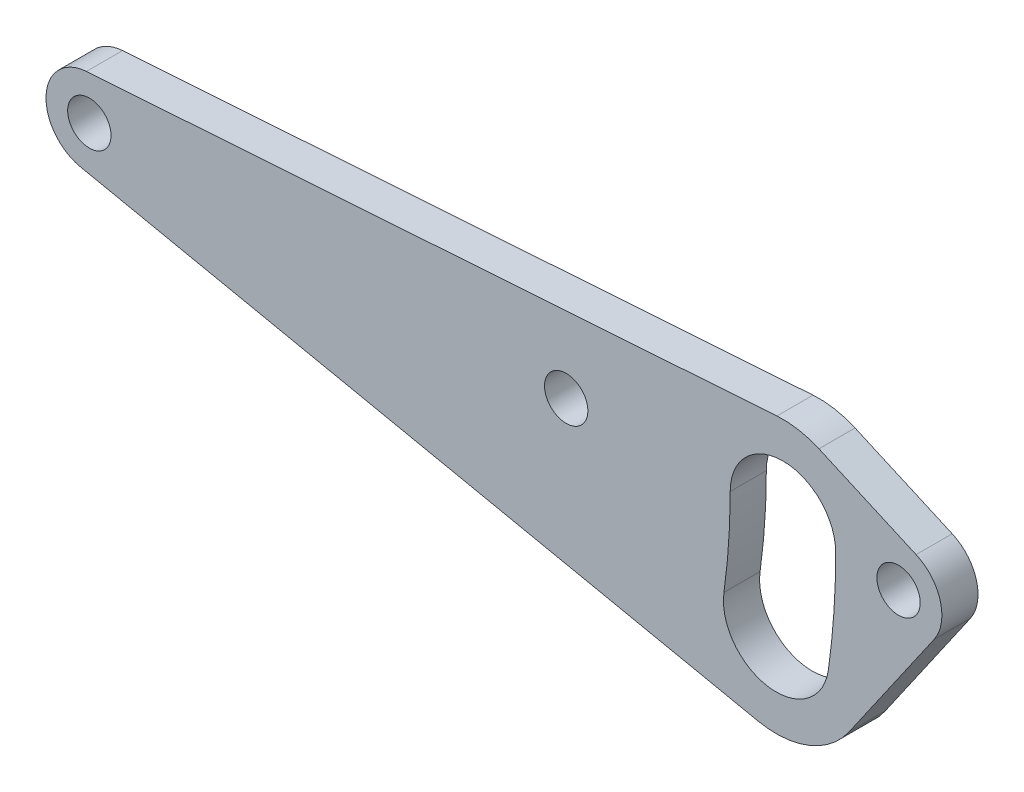
ISO-10303-21;
HEADER;
FILE_DESCRIPTION(('STEP AP214'),'2;1');
FILE_NAME('part.step','',(''),(''),'','','');
FILE_SCHEMA(('AUTOMOTIVE_DESIGN { 1 0 10303 214 1 1 1 1 }'));
ENDSEC;
DATA;
#1=APPLICATION_CONTEXT('core data for automotive mechanical design processes');
#2=APPLICATION_PROTOCOL_DEFINITION('international standard','automotive_design',2000,#1);
#3=PRODUCT_CONTEXT('',#1,'mechanical');
#4=PRODUCT('Part','Part','',(#3));
#5=PRODUCT_RELATED_PRODUCT_CATEGORY('part','',(#4));
#6=PRODUCT_DEFINITION_FORMATION('','',#4);
#7=PRODUCT_DEFINITION_CONTEXT('part definition',#1,'design');
#8=PRODUCT_DEFINITION('design','',#6,#7);
#9=PRODUCT_DEFINITION_SHAPE('','',#8);
#10=(LENGTH_UNIT() NAMED_UNIT(*) SI_UNIT(.MILLI.,.METRE.));
#11=(NAMED_UNIT(*) PLANE_ANGLE_UNIT() SI_UNIT($,.RADIAN.));
#12=(NAMED_UNIT(*) SI_UNIT($,.STERADIAN.) SOLID_ANGLE_UNIT());
#13=UNCERTAINTY_MEASURE_WITH_UNIT(LENGTH_MEASURE(1.E-05),#10,'distance_accuracy_value','');
#14=(GEOMETRIC_REPRESENTATION_CONTEXT(3) GLOBAL_UNCERTAINTY_ASSIGNED_CONTEXT((#13)) GLOBAL_UNIT_ASSIGNED_CONTEXT((#10,
#11,#12)) REPRESENTATION_CONTEXT('',''));
#15=CARTESIAN_POINT('',(0.,0.,0.));
#16=DIRECTION('',(0.,0.,1.));
#17=DIRECTION('',(1.,0.,0.));
#18=AXIS2_PLACEMENT_3D('',#15,#16,#17);
#19=CARTESIAN_POINT('',(28.,0.,1.25));
#20=DIRECTION('',(0.,0.,-1.));
#21=DIRECTION('',(0.,-1.,0.));
#22=AXIS2_PLACEMENT_3D('',#19,#20,#21);
#23=PLANE('',#22);
#24=CARTESIAN_POINT('',(5.,0.,1.25));
#25=DIRECTION('',(0.,0.,-1.));
#26=DIRECTION('',(1.,0.,0.));
#27=AXIS2_PLACEMENT_3D('',#24,#25,#26);
#28=CIRCLE('',#27,1.5);
#29=CARTESIAN_POINT('',(3.5,0.,1.25));
#30=VERTEX_POINT('',#29);
#31=EDGE_CURVE('E202',#30,#30,#28,.T.);
#32=ORIENTED_EDGE('',*,*,#31,.T.);
#33=EDGE_LOOP('',(#32));
#34=FACE_BOUND('',#33,.T.);
#35=CARTESIAN_POINT('',(-28.,0.,1.25));
#36=DIRECTION('',(0.,0.,-1.));
#37=DIRECTION('',(-1.,0.,0.));
#38=AXIS2_PLACEMENT_3D('',#35,#36,#37);
#39=CIRCLE('',#38,1.5);
#40=CARTESIAN_POINT('',(-26.5,0.,1.25));
#41=VERTEX_POINT('',#40);
#42=EDGE_CURVE('E274',#41,#41,#39,.T.);
#43=ORIENTED_EDGE('',*,*,#42,.T.);
#44=EDGE_LOOP('',(#43));
#45=FACE_BOUND('',#44,.T.);
#46=CARTESIAN_POINT('',(28.,0.,1.25));
#47=DIRECTION('',(0.,0.,-1.));
#48=DIRECTION('',(-1.,0.,0.));
#49=AXIS2_PLACEMENT_3D('',#46,#47,#48);
#50=CIRCLE('',#49,1.5);
#51=CARTESIAN_POINT('',(29.5,0.,1.25));
#52=VERTEX_POINT('',#51);
#53=EDGE_CURVE('E189',#52,#52,#50,.T.);
#54=ORIENTED_EDGE('',*,*,#53,.T.);
#55=EDGE_LOOP('',(#54));
#56=FACE_BOUND('',#55,.T.);
#57=CARTESIAN_POINT('',(19.5328672996,-6.680308846083,1.25));
#58=DIRECTION('',(0.,0.,-1.));
#59=DIRECTION('',(-1.,0.,0.));
#60=AXIS2_PLACEMENT_3D('',#57,#58,#59);
#61=CIRCLE('',#60,3.65);
#62=CARTESIAN_POINT('',(23.1473457505022,-7.18829066458692,1.25));
#63=VERTEX_POINT('',#62);
#64=CARTESIAN_POINT('',(15.918388848691,-6.17232702757881,1.25));
#65=VERTEX_POINT('',#64);
#66=EDGE_CURVE('E183',#63,#65,#61,.T.);
#67=ORIENTED_EDGE('',*,*,#66,.T.);
#68=CARTESIAN_POINT('',(-28.,0.,1.25));
#69=DIRECTION('',(0.,0.,-1.));
#70=DIRECTION('',(-1.,0.,0.));
#71=AXIS2_PLACEMENT_3D('',#68,#69,#70);
#72=CIRCLE('',#71,44.35);
#73=CARTESIAN_POINT('',(16.3499037523184,0.0923967544449283,1.25));
#74=VERTEX_POINT('',#73);
#75=EDGE_CURVE('E170',#74,#65,#72,.T.);
#76=ORIENTED_EDGE('',*,*,#75,.F.);
#77=CARTESIAN_POINT('',(19.99989583114,0.100000996919,1.25));
#78=DIRECTION('',(0.,0.,-1.));
#79=DIRECTION('',(-1.,0.,0.));
#80=AXIS2_PLACEMENT_3D('',#77,#78,#79);
#81=CIRCLE('',#80,3.65);
#82=CARTESIAN_POINT('',(23.6498879099665,0.107605239393021,1.25));
#83=VERTEX_POINT('',#82);
#84=EDGE_CURVE('E188',#74,#83,#81,.T.);
#85=ORIENTED_EDGE('',*,*,#84,.T.);
#86=CARTESIAN_POINT('',(-28.,0.,1.25));
#87=DIRECTION('',(0.,0.,-1.));
#88=DIRECTION('',(-1.,0.,0.));
#89=AXIS2_PLACEMENT_3D('',#86,#87,#88);
#90=CIRCLE('',#89,51.65);
#91=EDGE_CURVE('E162',#83,#63,#90,.T.);
#92=ORIENTED_EDGE('',*,*,#91,.T.);
#93=EDGE_LOOP('',(#67,#76,#85,#92));
#94=FACE_BOUND('',#93,.T.);
#95=CARTESIAN_POINT('',(19.99989583114,0.100000996919,1.25));
#96=DIRECTION('',(0.,0.,-1.));
#97=DIRECTION('',(-1.,0.,0.));
#98=AXIS2_PLACEMENT_3D('',#95,#96,#97);
#99=CIRCLE('',#98,6.15);
#100=CARTESIAN_POINT('',(19.5835179487465,6.2358896415289,1.25));
#101=VERTEX_POINT('',#100);
#102=CARTESIAN_POINT('',(22.4917087937308,5.72257764463988,1.25));
#103=VERTEX_POINT('',#102);
#104=EDGE_CURVE('E21',#101,#103,#99,.T.);
#105=ORIENTED_EDGE('',*,*,#104,.F.);
#106=DIRECTION('',(-0.997705470668249,-0.0677037207149533,0.));
#107=VECTOR('',#106,1.);
#108=CARTESIAN_POINT('',(-28.20311116214,2.993116412005,1.25));
#109=LINE('',#108,#107);
#110=CARTESIAN_POINT('',(-28.2031111621424,2.99311641200484,1.25));
#111=VERTEX_POINT('',#110);
#112=EDGE_CURVE('E210',#101,#111,#109,.T.);
#113=ORIENTED_EDGE('',*,*,#112,.T.);
#114=CARTESIAN_POINT('',(-28.,0.,1.25));
#115=DIRECTION('',(0.,0.,-1.));
#116=DIRECTION('',(-1.,0.,0.));
#117=AXIS2_PLACEMENT_3D('',#114,#115,#116);
#118=CIRCLE('',#117,3.);
#119=CARTESIAN_POINT('',(-28.6115783060517,-2.93700050656455,1.25));
#120=VERTEX_POINT('',#119);
#121=EDGE_CURVE('E250',#120,#111,#118,.T.);
#122=ORIENTED_EDGE('',*,*,#121,.F.);
#123=DIRECTION('',(0.979000168855088,-0.203859435351197,0.));
#124=VECTOR('',#123,1.);
#125=CARTESIAN_POINT('',(18.27913177219,-12.70115988454,1.25));
#126=LINE('',#125,#124);
#127=CARTESIAN_POINT('',(18.2791317721902,-12.7011598845401,1.25));
#128=VERTEX_POINT('',#127);
#129=EDGE_CURVE('E179',#120,#128,#126,.T.);
#130=ORIENTED_EDGE('',*,*,#129,.T.);
#131=CARTESIAN_POINT('',(19.5328672996,-6.680308846083,1.25));
#132=DIRECTION('',(0.,0.,-1.));
#133=DIRECTION('',(-1.,0.,0.));
#134=AXIS2_PLACEMENT_3D('',#131,#132,#133);
#135=CIRCLE('',#134,6.15);
#136=CARTESIAN_POINT('',(24.5862544933437,-10.1854162438802,1.25));
#137=VERTEX_POINT('',#136);
#138=EDGE_CURVE('E28',#137,#128,#135,.T.);
#139=ORIENTED_EDGE('',*,*,#138,.F.);
#140=DIRECTION('',(0.569936162243303,0.821688974592805,0.));
#141=VECTOR('',#140,1.);
#142=CARTESIAN_POINT('',(30.46506692378,-1.70980848673,1.25));
#143=LINE('',#142,#141);
#144=CARTESIAN_POINT('',(30.4650669237792,-1.70980848672995,1.25));
#145=VERTEX_POINT('',#144);
#146=EDGE_CURVE('E11',#137,#145,#143,.T.);
#147=ORIENTED_EDGE('',*,*,#146,.T.);
#148=CARTESIAN_POINT('',(28.,0.,1.25));
#149=DIRECTION('',(0.,0.,-1.));
#150=DIRECTION('',(-1.,0.,0.));
#151=AXIS2_PLACEMENT_3D('',#148,#149,#150);
#152=CIRCLE('',#151,3.);
#153=CARTESIAN_POINT('',(29.2155185183382,2.74272031596013,1.25));
#154=VERTEX_POINT('',#153);
#155=EDGE_CURVE('E143',#154,#145,#152,.T.);
#156=ORIENTED_EDGE('',*,*,#155,.F.);
#157=DIRECTION('',(-0.914240105320083,0.405172839445493,0.));
#158=VECTOR('',#157,1.);
#159=CARTESIAN_POINT('',(29.21551851834,2.74272031596,1.25));
#160=LINE('',#159,#158);
#161=EDGE_CURVE('E155',#154,#103,#160,.T.);
#162=ORIENTED_EDGE('',*,*,#161,.T.);
#163=EDGE_LOOP('',(#105,#113,#122,#130,#139,#147,#156,#162));
#164=FACE_BOUND('',#163,.T.);
#165=ADVANCED_FACE('F17',(#34,#45,#56,#94,#164),#23,.F.);
#166=CARTESIAN_POINT('',(30.46506692378,-1.70980848673,1.25));
#167=DIRECTION('',(-0.821688974592805,0.569936162243303,0.));
#168=DIRECTION('',(0.,0.,1.));
#169=AXIS2_PLACEMENT_3D('',#166,#167,#168);
#170=PLANE('',#169);
#171=ORIENTED_EDGE('',*,*,#146,.F.);
#172=DIRECTION('',(0.,0.,1.));
#173=VECTOR('',#172,1.);
#174=CARTESIAN_POINT('',(24.5862544933436,-10.1854162438825,1.25));
#175=LINE('',#174,#173);
#176=CARTESIAN_POINT('',(24.5862544933425,-10.1854162438802,-1.25));
#177=VERTEX_POINT('',#176);
#178=EDGE_CURVE('E178',#177,#137,#175,.T.);
#179=ORIENTED_EDGE('',*,*,#178,.F.);
#180=DIRECTION('',(-0.569936162243465,-0.821688974592693,0.));
#181=VECTOR('',#180,1.);
#182=CARTESIAN_POINT('',(30.46506692378,-1.70980848673,-1.25));
#183=LINE('',#182,#181);
#184=CARTESIAN_POINT('',(30.465066923779,-1.70980848673019,-1.25));
#185=VERTEX_POINT('',#184);
#186=EDGE_CURVE('E159',#185,#177,#183,.T.);
#187=ORIENTED_EDGE('',*,*,#186,.F.);
#188=DIRECTION('',(0.,0.,-1.));
#189=VECTOR('',#188,1.);
#190=CARTESIAN_POINT('',(30.4650669237789,-1.70980848672922,1.25));
#191=LINE('',#190,#189);
#192=EDGE_CURVE('E150',#145,#185,#191,.T.);
#193=ORIENTED_EDGE('',*,*,#192,.F.);
#194=EDGE_LOOP('',(#171,#179,#187,#193));
#195=FACE_BOUND('',#194,.T.);
#196=ADVANCED_FACE('F157',(#195),#170,.F.);
#197=CARTESIAN_POINT('',(19.5328672996,-6.680308846083,1.25));
#198=DIRECTION('',(0.,0.,-1.));
#199=DIRECTION('',(-1.,0.,0.));
#200=AXIS2_PLACEMENT_3D('',#197,#198,#199);
#201=CYLINDRICAL_SURFACE('',#200,6.15);
#202=DIRECTION('',(0.,0.,-1.));
#203=VECTOR('',#202,1.);
#204=CARTESIAN_POINT('',(18.27913177219,-12.70115988454,1.25));
#205=LINE('',#204,#203);
#206=CARTESIAN_POINT('',(18.2791317721903,-12.7011598845401,-1.25));
#207=VERTEX_POINT('',#206);
#208=EDGE_CURVE('E175',#128,#207,#205,.T.);
#209=ORIENTED_EDGE('',*,*,#208,.T.);
#210=CARTESIAN_POINT('',(19.5328672996,-6.680308846083,-1.25));
#211=DIRECTION('',(0.,0.,-1.));
#212=DIRECTION('',(-1.,0.,0.));
#213=AXIS2_PLACEMENT_3D('',#210,#211,#212);
#214=CIRCLE('',#213,6.15);
#215=EDGE_CURVE('E224',#177,#207,#214,.T.);
#216=ORIENTED_EDGE('',*,*,#215,.F.);
#217=ORIENTED_EDGE('',*,*,#178,.T.);
#218=ORIENTED_EDGE('',*,*,#138,.T.);
#219=EDGE_LOOP('',(#209,#216,#217,#218));
#220=FACE_BOUND('',#219,.T.);
#221=ADVANCED_FACE('F473',(#220),#201,.T.);
#222=CARTESIAN_POINT('',(18.27913177219,-12.70115988454,1.25));
#223=DIRECTION('',(0.203859435351197,0.979000168855088,0.));
#224=DIRECTION('',(0.,0.,-1.));
#225=AXIS2_PLACEMENT_3D('',#222,#223,#224);
#226=PLANE('',#225);
#227=ORIENTED_EDGE('',*,*,#129,.F.);
#228=DIRECTION('',(0.,0.,1.));
#229=VECTOR('',#228,1.);
#230=CARTESIAN_POINT('',(-28.6115783060502,-2.93700050656597,1.25));
#231=LINE('',#230,#229);
#232=CARTESIAN_POINT('',(-28.6115783060518,-2.93700050656514,-1.25));
#233=VERTEX_POINT('',#232);
#234=EDGE_CURVE('E253',#233,#120,#231,.T.);
#235=ORIENTED_EDGE('',*,*,#234,.F.);
#236=DIRECTION('',(-0.979000168855093,0.203859435351173,0.));
#237=VECTOR('',#236,1.);
#238=CARTESIAN_POINT('',(18.27913177219,-12.70115988454,-1.25));
#239=LINE('',#238,#237);
#240=EDGE_CURVE('E228',#207,#233,#239,.T.);
#241=ORIENTED_EDGE('',*,*,#240,.F.);
#242=ORIENTED_EDGE('',*,*,#208,.F.);
#243=EDGE_LOOP('',(#227,#235,#241,#242));
#244=FACE_BOUND('',#243,.T.);
#245=ADVANCED_FACE('F464',(#244),#226,.F.);
#246=CARTESIAN_POINT('',(-28.20311116214,2.993116412005,1.25));
#247=DIRECTION('',(0.0677037207149533,-0.997705470668249,0.));
#248=DIRECTION('',(0.,0.,-1.));
#249=AXIS2_PLACEMENT_3D('',#246,#247,#248);
#250=PLANE('',#249);
#251=ORIENTED_EDGE('',*,*,#112,.F.);
#252=DIRECTION('',(0.,0.,1.));
#253=VECTOR('',#252,1.);
#254=CARTESIAN_POINT('',(19.58351794875,6.2358896415292,1.25));
#255=LINE('',#254,#253);
#256=CARTESIAN_POINT('',(19.5835179487465,6.23588964152886,-1.25));
#257=VERTEX_POINT('',#256);
#258=EDGE_CURVE('E134',#257,#101,#255,.T.);
#259=ORIENTED_EDGE('',*,*,#258,.F.);
#260=DIRECTION('',(0.997705470668249,0.0677037207149509,0.));
#261=VECTOR('',#260,1.);
#262=CARTESIAN_POINT('',(-28.20311116214,2.993116412005,-1.25));
#263=LINE('',#262,#261);
#264=CARTESIAN_POINT('',(-28.2031111621424,2.99311641200484,-1.25));
#265=VERTEX_POINT('',#264);
#266=EDGE_CURVE('E236',#265,#257,#263,.T.);
#267=ORIENTED_EDGE('',*,*,#266,.F.);
#268=DIRECTION('',(0.,0.,-1.));
#269=VECTOR('',#268,1.);
#270=CARTESIAN_POINT('',(-28.20311116214,2.993116412005,1.25));
#271=LINE('',#270,#269);
#272=EDGE_CURVE('E245',#111,#265,#271,.T.);
#273=ORIENTED_EDGE('',*,*,#272,.F.);
#274=EDGE_LOOP('',(#251,#259,#267,#273));
#275=FACE_BOUND('',#274,.T.);
#276=ADVANCED_FACE('F459',(#275),#250,.F.);
#277=CARTESIAN_POINT('',(19.99989583114,0.100000996919,1.25));
#278=DIRECTION('',(0.,0.,-1.));
#279=DIRECTION('',(-1.,0.,0.));
#280=AXIS2_PLACEMENT_3D('',#277,#278,#279);
#281=CYLINDRICAL_SURFACE('',#280,6.15);
#282=DIRECTION('',(0.,0.,-1.));
#283=VECTOR('',#282,1.);
#284=CARTESIAN_POINT('',(22.4917087937308,5.72257764463988,1.25));
#285=LINE('',#284,#283);
#286=CARTESIAN_POINT('',(22.4917087937296,5.72257764463929,-1.25));
#287=VERTEX_POINT('',#286);
#288=EDGE_CURVE('E207',#103,#287,#285,.T.);
#289=ORIENTED_EDGE('',*,*,#288,.T.);
#290=CARTESIAN_POINT('',(19.99989583114,0.100000996919,-1.25));
#291=DIRECTION('',(0.,0.,-1.));
#292=DIRECTION('',(-1.,0.,0.));
#293=AXIS2_PLACEMENT_3D('',#290,#291,#292);
#294=CIRCLE('',#293,6.15);
#295=EDGE_CURVE('E237',#257,#287,#294,.T.);
#296=ORIENTED_EDGE('',*,*,#295,.F.);
#297=ORIENTED_EDGE('',*,*,#258,.T.);
#298=ORIENTED_EDGE('',*,*,#104,.T.);
#299=EDGE_LOOP('',(#289,#296,#297,#298));
#300=FACE_BOUND('',#299,.T.);
#301=ADVANCED_FACE('F19',(#300),#281,.T.);
#302=CARTESIAN_POINT('',(29.21551851834,2.74272031596,1.25));
#303=DIRECTION('',(-0.405172839445493,-0.914240105320083,0.));
#304=DIRECTION('',(-0.914240105320083,0.405172839445493,0.));
#305=AXIS2_PLACEMENT_3D('',#302,#303,#304);
#306=PLANE('',#305);
#307=ORIENTED_EDGE('',*,*,#161,.F.);
#308=DIRECTION('',(0.,0.,1.));
#309=VECTOR('',#308,1.);
#310=CARTESIAN_POINT('',(29.2155185183395,2.74272031595891,1.25));
#311=LINE('',#310,#309);
#312=CARTESIAN_POINT('',(29.2155185183379,2.7427203159603,-1.25));
#313=VERTEX_POINT('',#312);
#314=EDGE_CURVE('E153',#313,#154,#311,.T.);
#315=ORIENTED_EDGE('',*,*,#314,.F.);
#316=DIRECTION('',(0.914240105320197,-0.405172839445237,0.));
#317=VECTOR('',#316,1.);
#318=CARTESIAN_POINT('',(22.49170879373,5.722577644638,-1.25));
#319=LINE('',#318,#317);
#320=EDGE_CURVE('E217',#287,#313,#319,.T.);
#321=ORIENTED_EDGE('',*,*,#320,.F.);
#322=ORIENTED_EDGE('',*,*,#288,.F.);
#323=EDGE_LOOP('',(#307,#315,#321,#322));
#324=FACE_BOUND('',#323,.T.);
#325=ADVANCED_FACE('F429',(#324),#306,.F.);
#326=CARTESIAN_POINT('',(28.,0.,1.25));
#327=DIRECTION('',(0.,0.,-1.));
#328=DIRECTION('',(0.962804380954943,0.270199415273182,0.));
#329=AXIS2_PLACEMENT_3D('',#326,#327,#328);
#330=CYLINDRICAL_SURFACE('',#329,3.);
#331=ORIENTED_EDGE('',*,*,#192,.T.);
#332=CARTESIAN_POINT('',(28.,0.,-1.25));
#333=DIRECTION('',(0.,0.,-1.));
#334=DIRECTION('',(-1.,0.,0.));
#335=AXIS2_PLACEMENT_3D('',#332,#333,#334);
#336=CIRCLE('',#335,3.);
#337=EDGE_CURVE('E214',#313,#185,#336,.T.);
#338=ORIENTED_EDGE('',*,*,#337,.F.);
#339=ORIENTED_EDGE('',*,*,#314,.T.);
#340=ORIENTED_EDGE('',*,*,#155,.T.);
#341=EDGE_LOOP('',(#331,#338,#339,#340));
#342=FACE_BOUND('',#341,.T.);
#343=ADVANCED_FACE('F148',(#342),#330,.T.);
#344=CARTESIAN_POINT('',(-28.,0.,1.25));
#345=DIRECTION('',(0.,0.,-1.));
#346=DIRECTION('',(0.997636172792463,-0.0687172957559308,0.));
#347=AXIS2_PLACEMENT_3D('',#344,#345,#346);
#348=CYLINDRICAL_SURFACE('',#347,51.65);
#349=ORIENTED_EDGE('',*,*,#91,.F.);
#350=DIRECTION('',(0.,0.,-1.));
#351=VECTOR('',#350,1.);
#352=CARTESIAN_POINT('',(23.6498879099665,0.107605239392993,1.25));
#353=LINE('',#352,#351);
#354=CARTESIAN_POINT('',(23.6498879099665,0.107605239393021,-1.25));
#355=VERTEX_POINT('',#354);
#356=EDGE_CURVE('E180',#83,#355,#353,.T.);
#357=ORIENTED_EDGE('',*,*,#356,.T.);
#358=CARTESIAN_POINT('',(-28.,0.,-1.25));
#359=DIRECTION('',(0.,0.,1.));
#360=DIRECTION('',(-1.,0.,0.));
#361=AXIS2_PLACEMENT_3D('',#358,#359,#360);
#362=CIRCLE('',#361,51.65);
#363=CARTESIAN_POINT('',(23.1473457505022,-7.18829066458692,-1.25));
#364=VERTEX_POINT('',#363);
#365=EDGE_CURVE('E78',#364,#355,#362,.T.);
#366=ORIENTED_EDGE('',*,*,#365,.F.);
#367=DIRECTION('',(0.,0.,-1.));
#368=VECTOR('',#367,1.);
#369=CARTESIAN_POINT('',(23.1473457505021,-7.18829066458729,1.25));
#370=LINE('',#369,#368);
#371=EDGE_CURVE('E232',#63,#364,#370,.T.);
#372=ORIENTED_EDGE('',*,*,#371,.F.);
#373=EDGE_LOOP('',(#349,#357,#366,#372));
#374=FACE_BOUND('',#373,.T.);
#375=ADVANCED_FACE('F420',(#374),#348,.F.);
#376=CARTESIAN_POINT('',(-28.,0.,1.25));
#377=DIRECTION('',(0.,0.,-1.));
#378=DIRECTION('',(0.997636172792463,-0.0687172957559302,0.));
#379=AXIS2_PLACEMENT_3D('',#376,#377,#378);
#380=CYLINDRICAL_SURFACE('',#379,44.35);
#381=DIRECTION('',(0.,0.,-1.));
#382=VECTOR('',#381,1.);
#383=CARTESIAN_POINT('',(15.9183888486887,-6.17232702757881,1.25));
#384=LINE('',#383,#382);
#385=CARTESIAN_POINT('',(15.918388848691,-6.17232702757881,-1.25));
#386=VERTEX_POINT('',#385);
#387=EDGE_CURVE('E194',#65,#386,#384,.T.);
#388=ORIENTED_EDGE('',*,*,#387,.T.);
#389=CARTESIAN_POINT('',(-28.,0.,-1.25));
#390=DIRECTION('',(0.,0.,-1.));
#391=DIRECTION('',(-1.,0.,0.));
#392=AXIS2_PLACEMENT_3D('',#389,#390,#391);
#393=CIRCLE('',#392,44.35);
#394=CARTESIAN_POINT('',(16.3499037523152,0.0923967544449386,-1.25));
#395=VERTEX_POINT('',#394);
#396=EDGE_CURVE('E94',#395,#386,#393,.T.);
#397=ORIENTED_EDGE('',*,*,#396,.F.);
#398=DIRECTION('',(0.,0.,1.));
#399=VECTOR('',#398,1.);
#400=CARTESIAN_POINT('',(16.3499037523169,0.0923967544449267,1.25));
#401=LINE('',#400,#399);
#402=EDGE_CURVE('E185',#395,#74,#401,.T.);
#403=ORIENTED_EDGE('',*,*,#402,.T.);
#404=ORIENTED_EDGE('',*,*,#75,.T.);
#405=EDGE_LOOP('',(#388,#397,#403,#404));
#406=FACE_BOUND('',#405,.T.);
#407=ADVANCED_FACE('F415',(#406),#380,.T.);
#408=CARTESIAN_POINT('',(28.,0.,-1.25));
#409=DIRECTION('',(0.,0.,-1.));
#410=DIRECTION('',(0.,-1.,0.));
#411=AXIS2_PLACEMENT_3D('',#408,#409,#410);
#412=PLANE('',#411);
#413=CARTESIAN_POINT('',(5.,0.,-1.25));
#414=DIRECTION('',(0.,0.,1.));
#415=DIRECTION('',(1.,0.,0.));
#416=AXIS2_PLACEMENT_3D('',#413,#414,#415);
#417=CIRCLE('',#416,1.5);
#418=CARTESIAN_POINT('',(3.5,0.,-1.25));
#419=VERTEX_POINT('',#418);
#420=EDGE_CURVE('E203',#419,#419,#417,.T.);
#421=ORIENTED_EDGE('',*,*,#420,.T.);
#422=EDGE_LOOP('',(#421));
#423=FACE_BOUND('',#422,.T.);
#424=CARTESIAN_POINT('',(-28.,0.,-1.25));
#425=DIRECTION('',(0.,0.,1.));
#426=DIRECTION('',(-1.,0.,0.));
#427=AXIS2_PLACEMENT_3D('',#424,#425,#426);
#428=CIRCLE('',#427,1.5);
#429=CARTESIAN_POINT('',(-26.5,0.,-1.25));
#430=VERTEX_POINT('',#429);
#431=EDGE_CURVE('E221',#430,#430,#428,.T.);
#432=ORIENTED_EDGE('',*,*,#431,.T.);
#433=EDGE_LOOP('',(#432));
#434=FACE_BOUND('',#433,.T.);
#435=CARTESIAN_POINT('',(28.,0.,-1.25));
#436=DIRECTION('',(0.,0.,1.));
#437=DIRECTION('',(-1.,0.,0.));
#438=AXIS2_PLACEMENT_3D('',#435,#436,#437);
#439=CIRCLE('',#438,1.5);
#440=CARTESIAN_POINT('',(29.5,0.,-1.25));
#441=VERTEX_POINT('',#440);
#442=EDGE_CURVE('E198',#441,#441,#439,.T.);
#443=ORIENTED_EDGE('',*,*,#442,.T.);
#444=EDGE_LOOP('',(#443));
#445=FACE_BOUND('',#444,.T.);
#446=ORIENTED_EDGE('',*,*,#396,.T.);
#447=CARTESIAN_POINT('',(19.5328672996,-6.680308846083,-1.25));
#448=DIRECTION('',(0.,0.,1.));
#449=DIRECTION('',(-1.,0.,0.));
#450=AXIS2_PLACEMENT_3D('',#447,#448,#449);
#451=CIRCLE('',#450,3.65);
#452=EDGE_CURVE('E213',#386,#364,#451,.T.);
#453=ORIENTED_EDGE('',*,*,#452,.T.);
#454=ORIENTED_EDGE('',*,*,#365,.T.);
#455=CARTESIAN_POINT('',(19.99989583114,0.100000996919,-1.25));
#456=DIRECTION('',(0.,0.,1.));
#457=DIRECTION('',(-1.,0.,0.));
#458=AXIS2_PLACEMENT_3D('',#455,#456,#457);
#459=CIRCLE('',#458,3.65);
#460=EDGE_CURVE('E184',#355,#395,#459,.T.);
#461=ORIENTED_EDGE('',*,*,#460,.T.);
#462=EDGE_LOOP('',(#446,#453,#454,#461));
#463=FACE_BOUND('',#462,.T.);
#464=ORIENTED_EDGE('',*,*,#320,.T.);
#465=ORIENTED_EDGE('',*,*,#337,.T.);
#466=ORIENTED_EDGE('',*,*,#186,.T.);
#467=ORIENTED_EDGE('',*,*,#215,.T.);
#468=ORIENTED_EDGE('',*,*,#240,.T.);
#469=CARTESIAN_POINT('',(-28.,0.,-1.25));
#470=DIRECTION('',(0.,0.,-1.));
#471=DIRECTION('',(-1.,0.,0.));
#472=AXIS2_PLACEMENT_3D('',#469,#470,#471);
#473=CIRCLE('',#472,3.);
#474=EDGE_CURVE('E249',#233,#265,#473,.T.);
#475=ORIENTED_EDGE('',*,*,#474,.T.);
#476=ORIENTED_EDGE('',*,*,#266,.T.);
#477=ORIENTED_EDGE('',*,*,#295,.T.);
#478=EDGE_LOOP('',(#464,#465,#466,#467,#468,#475,#476,#477));
#479=FACE_BOUND('',#478,.T.);
#480=ADVANCED_FACE('F393',(#423,#434,#445,#463,#479),#412,.T.);
#481=CARTESIAN_POINT('',(-28.,0.,1.25));
#482=DIRECTION('',(0.,0.,-1.));
#483=DIRECTION('',(-1.,0.,0.));
#484=AXIS2_PLACEMENT_3D('',#481,#482,#483);
#485=CYLINDRICAL_SURFACE('',#484,3.);
#486=ORIENTED_EDGE('',*,*,#121,.T.);
#487=ORIENTED_EDGE('',*,*,#272,.T.);
#488=ORIENTED_EDGE('',*,*,#474,.F.);
#489=ORIENTED_EDGE('',*,*,#234,.T.);
#490=EDGE_LOOP('',(#486,#487,#488,#489));
#491=FACE_BOUND('',#490,.T.);
#492=ADVANCED_FACE('F388',(#491),#485,.T.);
#493=CARTESIAN_POINT('',(5.,0.,-1.25));
#494=DIRECTION('',(0.,0.,1.));
#495=DIRECTION('',(1.,0.,0.));
#496=AXIS2_PLACEMENT_3D('',#493,#494,#495);
#497=CYLINDRICAL_SURFACE('',#496,1.5);
#498=ORIENTED_EDGE('',*,*,#420,.F.);
#499=DIRECTION('',(0.,0.,1.));
#500=VECTOR('',#499,1.);
#501=CARTESIAN_POINT('',(3.5,0.,-1.25));
#502=LINE('',#501,#500);
#503=EDGE_CURVE('E199',#419,#30,#502,.T.);
#504=ORIENTED_EDGE('',*,*,#503,.T.);
#505=ORIENTED_EDGE('',*,*,#31,.F.);
#506=ORIENTED_EDGE('',*,*,#503,.F.);
#507=EDGE_LOOP('',(#498,#504,#505,#506));
#508=FACE_BOUND('',#507,.T.);
#509=ADVANCED_FACE('F381',(#508),#497,.F.);
#510=CARTESIAN_POINT('',(-28.,0.,1.25));
#511=DIRECTION('',(0.,0.,-1.));
#512=DIRECTION('',(-1.,0.,0.));
#513=AXIS2_PLACEMENT_3D('',#510,#511,#512);
#514=CYLINDRICAL_SURFACE('',#513,1.5);
#515=ORIENTED_EDGE('',*,*,#42,.F.);
#516=DIRECTION('',(0.,0.,-1.));
#517=VECTOR('',#516,1.);
#518=CARTESIAN_POINT('',(-26.5,0.,1.25));
#519=LINE('',#518,#517);
#520=EDGE_CURVE('E278',#41,#430,#519,.T.);
#521=ORIENTED_EDGE('',*,*,#520,.T.);
#522=ORIENTED_EDGE('',*,*,#431,.F.);
#523=ORIENTED_EDGE('',*,*,#520,.F.);
#524=EDGE_LOOP('',(#515,#521,#522,#523));
#525=FACE_BOUND('',#524,.T.);
#526=ADVANCED_FACE('F375',(#525),#514,.F.);
#527=CARTESIAN_POINT('',(28.,0.,1.25));
#528=DIRECTION('',(0.,0.,-1.));
#529=DIRECTION('',(-1.,0.,0.));
#530=AXIS2_PLACEMENT_3D('',#527,#528,#529);
#531=CYLINDRICAL_SURFACE('',#530,1.5);
#532=ORIENTED_EDGE('',*,*,#53,.F.);
#533=DIRECTION('',(0.,0.,-1.));
#534=VECTOR('',#533,1.);
#535=CARTESIAN_POINT('',(29.5,0.,1.25));
#536=LINE('',#535,#534);
#537=EDGE_CURVE('E193',#52,#441,#536,.T.);
#538=ORIENTED_EDGE('',*,*,#537,.T.);
#539=ORIENTED_EDGE('',*,*,#442,.F.);
#540=ORIENTED_EDGE('',*,*,#537,.F.);
#541=EDGE_LOOP('',(#532,#538,#539,#540));
#542=FACE_BOUND('',#541,.T.);
#543=ADVANCED_FACE('F380',(#542),#531,.F.);
#544=CARTESIAN_POINT('',(19.5328672996,-6.680308846083,1.25));
#545=DIRECTION('',(0.,0.,-1.));
#546=DIRECTION('',(-1.,0.,0.));
#547=AXIS2_PLACEMENT_3D('',#544,#545,#546);
#548=CYLINDRICAL_SURFACE('',#547,3.65);
#549=ORIENTED_EDGE('',*,*,#66,.F.);
#550=ORIENTED_EDGE('',*,*,#371,.T.);
#551=ORIENTED_EDGE('',*,*,#452,.F.);
#552=ORIENTED_EDGE('',*,*,#387,.F.);
#553=EDGE_LOOP('',(#549,#550,#551,#552));
#554=FACE_BOUND('',#553,.T.);
#555=ADVANCED_FACE('F434',(#554),#548,.F.);
#556=CARTESIAN_POINT('',(19.99989583114,0.100000996919,1.25));
#557=DIRECTION('',(0.,0.,-1.));
#558=DIRECTION('',(-1.,0.,0.));
#559=AXIS2_PLACEMENT_3D('',#556,#557,#558);
#560=CYLINDRICAL_SURFACE('',#559,3.65);
#561=ORIENTED_EDGE('',*,*,#84,.F.);
#562=ORIENTED_EDGE('',*,*,#402,.F.);
#563=ORIENTED_EDGE('',*,*,#460,.F.);
#564=ORIENTED_EDGE('',*,*,#356,.F.);
#565=EDGE_LOOP('',(#561,#562,#563,#564));
#566=FACE_BOUND('',#565,.T.);
#567=ADVANCED_FACE('F439',(#566),#560,.F.);
#568=CLOSED_SHELL('',(#165,#196,#221,#245,#276,#301,#325,#343,#375,#407,#480,#492,#509,#526,
#543,#555,#567));
#569=MANIFOLD_SOLID_BREP('B1',#568);
#570=ADVANCED_BREP_SHAPE_REPRESENTATION('',(#18,#569),#14);
#571=SHAPE_DEFINITION_REPRESENTATION(#9,#570);
ENDSEC;
END-ISO-10303-21;
